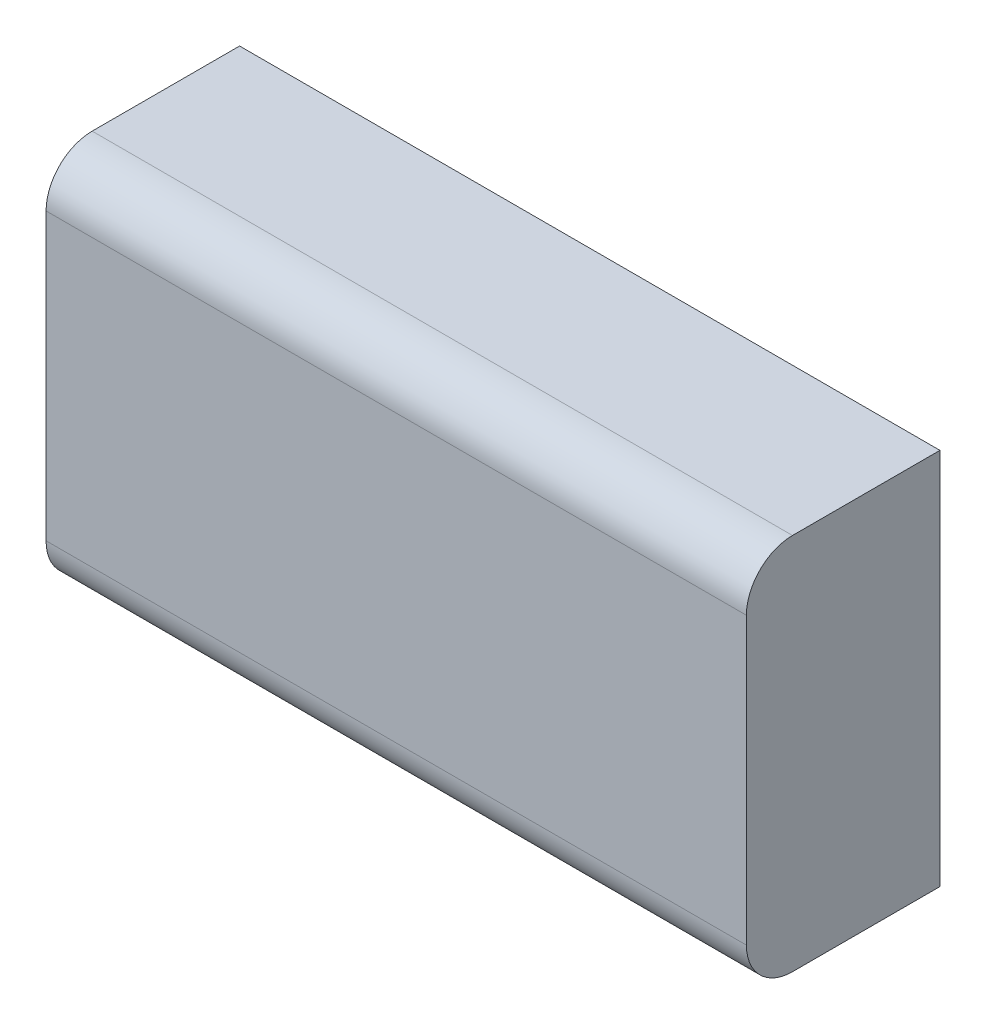
ISO-10303-21;
HEADER;
FILE_DESCRIPTION(('STEP AP214'),'2;1');
FILE_NAME('part.step','',(''),(''),'','','');
FILE_SCHEMA(('AUTOMOTIVE_DESIGN { 1 0 10303 214 1 1 1 1 }'));
ENDSEC;
DATA;
#1=APPLICATION_CONTEXT('core data for automotive mechanical design processes');
#2=APPLICATION_PROTOCOL_DEFINITION('international standard','automotive_design',2000,#1);
#3=PRODUCT_CONTEXT('',#1,'mechanical');
#4=PRODUCT('Part','Part','',(#3));
#5=PRODUCT_RELATED_PRODUCT_CATEGORY('part','',(#4));
#6=PRODUCT_DEFINITION_FORMATION('','',#4);
#7=PRODUCT_DEFINITION_CONTEXT('part definition',#1,'design');
#8=PRODUCT_DEFINITION('design','',#6,#7);
#9=PRODUCT_DEFINITION_SHAPE('','',#8);
#10=(LENGTH_UNIT() NAMED_UNIT(*) SI_UNIT(.MILLI.,.METRE.));
#11=(NAMED_UNIT(*) PLANE_ANGLE_UNIT() SI_UNIT($,.RADIAN.));
#12=(NAMED_UNIT(*) SI_UNIT($,.STERADIAN.) SOLID_ANGLE_UNIT());
#13=UNCERTAINTY_MEASURE_WITH_UNIT(LENGTH_MEASURE(1.E-05),#10,'distance_accuracy_value','');
#14=(GEOMETRIC_REPRESENTATION_CONTEXT(3) GLOBAL_UNCERTAINTY_ASSIGNED_CONTEXT((#13)) GLOBAL_UNIT_ASSIGNED_CONTEXT((#10,
#11,#12)) REPRESENTATION_CONTEXT('',''));
#15=CARTESIAN_POINT('',(0.,0.,0.));
#16=DIRECTION('',(0.,0.,1.));
#17=DIRECTION('',(1.,0.,0.));
#18=AXIS2_PLACEMENT_3D('',#15,#16,#17);
#19=CARTESIAN_POINT('',(38.,20.5,21.));
#20=DIRECTION('',(-1.,0.,0.));
#21=DIRECTION('',(0.,0.,1.));
#22=AXIS2_PLACEMENT_3D('',#19,#20,#21);
#23=PLANE('',#22);
#24=DIRECTION('',(0.,1.,0.));
#25=VECTOR('',#24,1.);
#26=CARTESIAN_POINT('',(38.,20.5,21.));
#27=LINE('',#26,#25);
#28=CARTESIAN_POINT('',(38.,-15.5,21.));
#29=VERTEX_POINT('',#28);
#30=CARTESIAN_POINT('',(38.,15.5,21.));
#31=VERTEX_POINT('',#30);
#32=EDGE_CURVE('E118',#29,#31,#27,.T.);
#33=ORIENTED_EDGE('',*,*,#32,.F.);
#34=CARTESIAN_POINT('',(38.,-15.5,16.));
#35=DIRECTION('',(-1.,0.,0.));
#36=DIRECTION('',(0.,0.,1.));
#37=AXIS2_PLACEMENT_3D('',#34,#35,#36);
#38=CIRCLE('',#37,5.);
#39=CARTESIAN_POINT('',(38.,-20.5,16.));
#40=VERTEX_POINT('',#39);
#41=EDGE_CURVE('E130',#29,#40,#38,.F.);
#42=ORIENTED_EDGE('',*,*,#41,.T.);
#43=DIRECTION('',(0.,0.,-1.));
#44=VECTOR('',#43,1.);
#45=CARTESIAN_POINT('',(38.,-20.5,21.));
#46=LINE('',#45,#44);
#47=CARTESIAN_POINT('',(38.,-20.5,0.));
#48=VERTEX_POINT('',#47);
#49=EDGE_CURVE('E108',#40,#48,#46,.T.);
#50=ORIENTED_EDGE('',*,*,#49,.T.);
#51=DIRECTION('',(0.,1.,0.));
#52=VECTOR('',#51,1.);
#53=CARTESIAN_POINT('',(38.,20.5,0.));
#54=LINE('',#53,#52);
#55=CARTESIAN_POINT('',(38.,20.5,0.));
#56=VERTEX_POINT('',#55);
#57=EDGE_CURVE('E103',#48,#56,#54,.T.);
#58=ORIENTED_EDGE('',*,*,#57,.T.);
#59=DIRECTION('',(0.,0.,-1.));
#60=VECTOR('',#59,1.);
#61=CARTESIAN_POINT('',(38.,20.5,21.));
#62=LINE('',#61,#60);
#63=CARTESIAN_POINT('',(38.,20.5,16.));
#64=VERTEX_POINT('',#63);
#65=EDGE_CURVE('E87',#64,#56,#62,.T.);
#66=ORIENTED_EDGE('',*,*,#65,.F.);
#67=CARTESIAN_POINT('',(38.,15.5,16.));
#68=DIRECTION('',(-1.,0.,0.));
#69=DIRECTION('',(0.,0.,1.));
#70=AXIS2_PLACEMENT_3D('',#67,#68,#69);
#71=CIRCLE('',#70,5.);
#72=EDGE_CURVE('E128',#64,#31,#71,.F.);
#73=ORIENTED_EDGE('',*,*,#72,.T.);
#74=EDGE_LOOP('',(#33,#42,#50,#58,#66,#73));
#75=FACE_BOUND('',#74,.T.);
#76=ADVANCED_FACE('F34',(#75),#23,.F.);
#77=CARTESIAN_POINT('',(-38.,20.5,21.));
#78=DIRECTION('',(0.,-1.,0.));
#79=DIRECTION('',(0.,0.,-1.));
#80=AXIS2_PLACEMENT_3D('',#77,#78,#79);
#81=PLANE('',#80);
#82=DIRECTION('',(0.,0.,-1.));
#83=VECTOR('',#82,1.);
#84=CARTESIAN_POINT('',(-38.,20.5,21.));
#85=LINE('',#84,#83);
#86=CARTESIAN_POINT('',(-38.,20.5,16.));
#87=VERTEX_POINT('',#86);
#88=CARTESIAN_POINT('',(-38.,20.5,0.));
#89=VERTEX_POINT('',#88);
#90=EDGE_CURVE('E97',#87,#89,#85,.T.);
#91=ORIENTED_EDGE('',*,*,#90,.F.);
#92=DIRECTION('',(-1.,0.,0.));
#93=VECTOR('',#92,1.);
#94=CARTESIAN_POINT('',(38.,20.5,16.));
#95=LINE('',#94,#93);
#96=EDGE_CURVE('E11',#87,#64,#95,.F.);
#97=ORIENTED_EDGE('',*,*,#96,.T.);
#98=ORIENTED_EDGE('',*,*,#65,.T.);
#99=DIRECTION('',(-1.,0.,0.));
#100=VECTOR('',#99,1.);
#101=CARTESIAN_POINT('',(-38.,20.5,0.));
#102=LINE('',#101,#100);
#103=EDGE_CURVE('E90',#56,#89,#102,.T.);
#104=ORIENTED_EDGE('',*,*,#103,.T.);
#105=EDGE_LOOP('',(#91,#97,#98,#104));
#106=FACE_BOUND('',#105,.T.);
#107=ADVANCED_FACE('F89',(#106),#81,.F.);
#108=CARTESIAN_POINT('',(-38.,20.5,21.));
#109=DIRECTION('',(1.,0.,0.));
#110=DIRECTION('',(0.,1.,0.));
#111=AXIS2_PLACEMENT_3D('',#108,#109,#110);
#112=PLANE('',#111);
#113=DIRECTION('',(0.,0.,-1.));
#114=VECTOR('',#113,1.);
#115=CARTESIAN_POINT('',(-38.,-20.5,21.));
#116=LINE('',#115,#114);
#117=CARTESIAN_POINT('',(-38.,-20.5,16.));
#118=VERTEX_POINT('',#117);
#119=CARTESIAN_POINT('',(-38.,-20.5,0.));
#120=VERTEX_POINT('',#119);
#121=EDGE_CURVE('E120',#118,#120,#116,.T.);
#122=ORIENTED_EDGE('',*,*,#121,.F.);
#123=CARTESIAN_POINT('',(-38.,-15.5,16.));
#124=DIRECTION('',(1.,0.,0.));
#125=DIRECTION('',(0.,1.,0.));
#126=AXIS2_PLACEMENT_3D('',#123,#124,#125);
#127=CIRCLE('',#126,5.);
#128=CARTESIAN_POINT('',(-38.,-15.5,21.));
#129=VERTEX_POINT('',#128);
#130=EDGE_CURVE('E42',#118,#129,#127,.F.);
#131=ORIENTED_EDGE('',*,*,#130,.T.);
#132=DIRECTION('',(0.,-1.,0.));
#133=VECTOR('',#132,1.);
#134=CARTESIAN_POINT('',(-38.,20.5,21.));
#135=LINE('',#134,#133);
#136=CARTESIAN_POINT('',(-38.,15.5,21.));
#137=VERTEX_POINT('',#136);
#138=EDGE_CURVE('E112',#137,#129,#135,.T.);
#139=ORIENTED_EDGE('',*,*,#138,.F.);
#140=CARTESIAN_POINT('',(-38.,15.5,16.));
#141=DIRECTION('',(1.,0.,0.));
#142=DIRECTION('',(0.,1.,0.));
#143=AXIS2_PLACEMENT_3D('',#140,#141,#142);
#144=CIRCLE('',#143,5.);
#145=EDGE_CURVE('E49',#137,#87,#144,.F.);
#146=ORIENTED_EDGE('',*,*,#145,.T.);
#147=ORIENTED_EDGE('',*,*,#90,.T.);
#148=DIRECTION('',(0.,-1.,0.));
#149=VECTOR('',#148,1.);
#150=CARTESIAN_POINT('',(-38.,20.5,0.));
#151=LINE('',#150,#149);
#152=EDGE_CURVE('E105',#89,#120,#151,.T.);
#153=ORIENTED_EDGE('',*,*,#152,.T.);
#154=EDGE_LOOP('',(#122,#131,#139,#146,#147,#153));
#155=FACE_BOUND('',#154,.T.);
#156=ADVANCED_FACE('F135',(#155),#112,.F.);
#157=CARTESIAN_POINT('',(-38.,-20.5,21.));
#158=DIRECTION('',(0.,1.,0.));
#159=DIRECTION('',(0.,0.,1.));
#160=AXIS2_PLACEMENT_3D('',#157,#158,#159);
#161=PLANE('',#160);
#162=ORIENTED_EDGE('',*,*,#49,.F.);
#163=DIRECTION('',(1.,0.,0.));
#164=VECTOR('',#163,1.);
#165=CARTESIAN_POINT('',(-38.,-20.5,16.));
#166=LINE('',#165,#164);
#167=EDGE_CURVE('E57',#40,#118,#166,.F.);
#168=ORIENTED_EDGE('',*,*,#167,.T.);
#169=ORIENTED_EDGE('',*,*,#121,.T.);
#170=DIRECTION('',(1.,0.,0.));
#171=VECTOR('',#170,1.);
#172=CARTESIAN_POINT('',(-38.,-20.5,0.));
#173=LINE('',#172,#171);
#174=EDGE_CURVE('E116',#120,#48,#173,.T.);
#175=ORIENTED_EDGE('',*,*,#174,.T.);
#176=EDGE_LOOP('',(#162,#168,#169,#175));
#177=FACE_BOUND('',#176,.T.);
#178=ADVANCED_FACE('F143',(#177),#161,.F.);
#179=CARTESIAN_POINT('',(0.,0.,21.));
#180=DIRECTION('',(0.,0.,1.));
#181=DIRECTION('',(1.,0.,0.));
#182=AXIS2_PLACEMENT_3D('',#179,#180,#181);
#183=PLANE('',#182);
#184=ORIENTED_EDGE('',*,*,#138,.T.);
#185=DIRECTION('',(1.,0.,0.));
#186=VECTOR('',#185,1.);
#187=CARTESIAN_POINT('',(38.,-15.5,21.));
#188=LINE('',#187,#186);
#189=EDGE_CURVE('E125',#129,#29,#188,.T.);
#190=ORIENTED_EDGE('',*,*,#189,.T.);
#191=ORIENTED_EDGE('',*,*,#32,.T.);
#192=DIRECTION('',(-1.,0.,0.));
#193=VECTOR('',#192,1.);
#194=CARTESIAN_POINT('',(-38.,15.5,21.));
#195=LINE('',#194,#193);
#196=EDGE_CURVE('E96',#31,#137,#195,.T.);
#197=ORIENTED_EDGE('',*,*,#196,.T.);
#198=EDGE_LOOP('',(#184,#190,#191,#197));
#199=FACE_BOUND('',#198,.T.);
#200=ADVANCED_FACE('F139',(#199),#183,.T.);
#201=CARTESIAN_POINT('',(0.,0.,0.));
#202=DIRECTION('',(0.,0.,1.));
#203=DIRECTION('',(1.,0.,0.));
#204=AXIS2_PLACEMENT_3D('',#201,#202,#203);
#205=PLANE('',#204);
#206=ORIENTED_EDGE('',*,*,#57,.F.);
#207=ORIENTED_EDGE('',*,*,#174,.F.);
#208=ORIENTED_EDGE('',*,*,#152,.F.);
#209=ORIENTED_EDGE('',*,*,#103,.F.);
#210=EDGE_LOOP('',(#206,#207,#208,#209));
#211=FACE_BOUND('',#210,.T.);
#212=ADVANCED_FACE('F101',(#211),#205,.F.);
#213=CARTESIAN_POINT('',(0.,-15.5,16.));
#214=DIRECTION('',(-1.,0.,0.));
#215=DIRECTION('',(0.,0.,1.));
#216=AXIS2_PLACEMENT_3D('',#213,#214,#215);
#217=CYLINDRICAL_SURFACE('',#216,5.);
#218=ORIENTED_EDGE('',*,*,#130,.F.);
#219=ORIENTED_EDGE('',*,*,#167,.F.);
#220=ORIENTED_EDGE('',*,*,#41,.F.);
#221=ORIENTED_EDGE('',*,*,#189,.F.);
#222=EDGE_LOOP('',(#218,#219,#220,#221));
#223=FACE_BOUND('',#222,.T.);
#224=ADVANCED_FACE('F142',(#223),#217,.T.);
#225=CARTESIAN_POINT('',(0.,15.5,16.));
#226=DIRECTION('',(1.,0.,0.));
#227=DIRECTION('',(0.,0.,-1.));
#228=AXIS2_PLACEMENT_3D('',#225,#226,#227);
#229=CYLINDRICAL_SURFACE('',#228,5.);
#230=ORIENTED_EDGE('',*,*,#72,.F.);
#231=ORIENTED_EDGE('',*,*,#96,.F.);
#232=ORIENTED_EDGE('',*,*,#145,.F.);
#233=ORIENTED_EDGE('',*,*,#196,.F.);
#234=EDGE_LOOP('',(#230,#231,#232,#233));
#235=FACE_BOUND('',#234,.T.);
#236=ADVANCED_FACE('F36',(#235),#229,.T.);
#237=CLOSED_SHELL('',(#76,#107,#156,#178,#200,#212,#224,#236));
#238=MANIFOLD_SOLID_BREP('B2',#237);
#239=ADVANCED_BREP_SHAPE_REPRESENTATION('',(#18,#238),#14);
#240=SHAPE_DEFINITION_REPRESENTATION(#9,#239);
ENDSEC;
END-ISO-10303-21;
